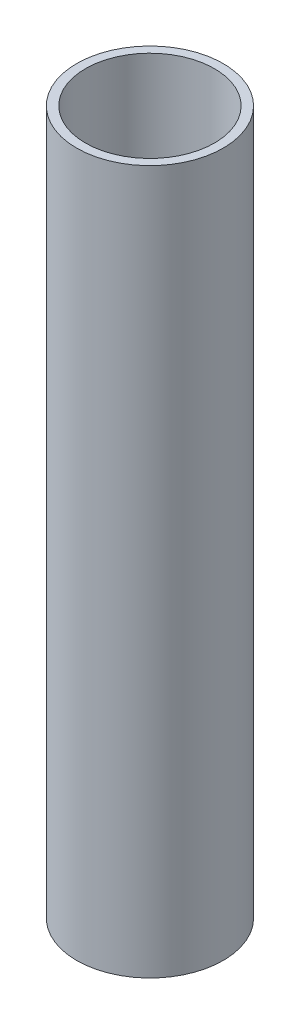
ISO-10303-21;
HEADER;
FILE_DESCRIPTION(('STEP AP214'),'2;1');
FILE_NAME('part.step','',(''),(''),'','','');
FILE_SCHEMA(('AUTOMOTIVE_DESIGN { 1 0 10303 214 1 1 1 1 }'));
ENDSEC;
DATA;
#1=APPLICATION_CONTEXT('core data for automotive mechanical design processes');
#2=APPLICATION_PROTOCOL_DEFINITION('international standard','automotive_design',2000,#1);
#3=PRODUCT_CONTEXT('',#1,'mechanical');
#4=PRODUCT('Part','Part','',(#3));
#5=PRODUCT_RELATED_PRODUCT_CATEGORY('part','',(#4));
#6=PRODUCT_DEFINITION_FORMATION('','',#4);
#7=PRODUCT_DEFINITION_CONTEXT('part definition',#1,'design');
#8=PRODUCT_DEFINITION('design','',#6,#7);
#9=PRODUCT_DEFINITION_SHAPE('','',#8);
#10=(LENGTH_UNIT() NAMED_UNIT(*) SI_UNIT(.MILLI.,.METRE.));
#11=(NAMED_UNIT(*) PLANE_ANGLE_UNIT() SI_UNIT($,.RADIAN.));
#12=(NAMED_UNIT(*) SI_UNIT($,.STERADIAN.) SOLID_ANGLE_UNIT());
#13=UNCERTAINTY_MEASURE_WITH_UNIT(LENGTH_MEASURE(1.E-05),#10,'distance_accuracy_value','');
#14=(GEOMETRIC_REPRESENTATION_CONTEXT(3) GLOBAL_UNCERTAINTY_ASSIGNED_CONTEXT((#13)) GLOBAL_UNIT_ASSIGNED_CONTEXT((#10,
#11,#12)) REPRESENTATION_CONTEXT('',''));
#15=CARTESIAN_POINT('',(0.,0.,0.));
#16=DIRECTION('',(0.,0.,1.));
#17=DIRECTION('',(1.,0.,0.));
#18=AXIS2_PLACEMENT_3D('',#15,#16,#17);
#19=CARTESIAN_POINT('',(0.,120.,0.));
#20=DIRECTION('',(0.,1.,0.));
#21=DIRECTION('',(0.,0.,1.));
#22=AXIS2_PLACEMENT_3D('',#19,#20,#21);
#23=PLANE('',#22);
#24=CARTESIAN_POINT('',(0.,120.,0.));
#25=DIRECTION('',(0.,1.,0.));
#26=DIRECTION('',(0.,0.,1.));
#27=AXIS2_PLACEMENT_3D('',#24,#25,#26);
#28=CIRCLE('',#27,12.5);
#29=CARTESIAN_POINT('',(0.,120.,12.5));
#30=VERTEX_POINT('',#29);
#31=EDGE_CURVE('E10',#30,#30,#28,.T.);
#32=ORIENTED_EDGE('',*,*,#31,.T.);
#33=EDGE_LOOP('',(#32));
#34=FACE_BOUND('',#33,.T.);
#35=CARTESIAN_POINT('',(0.,120.,0.));
#36=DIRECTION('',(0.,1.,0.));
#37=DIRECTION('',(0.,0.,1.));
#38=AXIS2_PLACEMENT_3D('',#35,#36,#37);
#39=CIRCLE('',#38,11.);
#40=CARTESIAN_POINT('',(0.,120.,11.));
#41=VERTEX_POINT('',#40);
#42=EDGE_CURVE('E50',#41,#41,#39,.T.);
#43=ORIENTED_EDGE('',*,*,#42,.F.);
#44=EDGE_LOOP('',(#43));
#45=FACE_BOUND('',#44,.T.);
#46=ADVANCED_FACE('F37',(#34,#45),#23,.T.);
#47=CARTESIAN_POINT('',(0.,0.,0.));
#48=DIRECTION('',(0.,1.,0.));
#49=DIRECTION('',(0.,0.,1.));
#50=AXIS2_PLACEMENT_3D('',#47,#48,#49);
#51=PLANE('',#50);
#52=CARTESIAN_POINT('',(0.,0.,0.));
#53=DIRECTION('',(0.,1.,0.));
#54=DIRECTION('',(0.,0.,1.));
#55=AXIS2_PLACEMENT_3D('',#52,#53,#54);
#56=CIRCLE('',#55,12.5);
#57=CARTESIAN_POINT('',(0.,0.,12.5));
#58=VERTEX_POINT('',#57);
#59=EDGE_CURVE('E41',#58,#58,#56,.T.);
#60=ORIENTED_EDGE('',*,*,#59,.F.);
#61=EDGE_LOOP('',(#60));
#62=FACE_BOUND('',#61,.T.);
#63=CARTESIAN_POINT('',(0.,0.,0.));
#64=DIRECTION('',(0.,1.,0.));
#65=DIRECTION('',(0.,0.,1.));
#66=AXIS2_PLACEMENT_3D('',#63,#64,#65);
#67=CIRCLE('',#66,11.);
#68=CARTESIAN_POINT('',(0.,0.,11.));
#69=VERTEX_POINT('',#68);
#70=EDGE_CURVE('E52',#69,#69,#67,.T.);
#71=ORIENTED_EDGE('',*,*,#70,.T.);
#72=EDGE_LOOP('',(#71));
#73=FACE_BOUND('',#72,.T.);
#74=ADVANCED_FACE('F64',(#62,#73),#51,.F.);
#75=CARTESIAN_POINT('',(0.,120.,0.));
#76=DIRECTION('',(0.,-1.,0.));
#77=DIRECTION('',(0.,0.,-1.));
#78=AXIS2_PLACEMENT_3D('',#75,#76,#77);
#79=CYLINDRICAL_SURFACE('',#78,12.5);
#80=ORIENTED_EDGE('',*,*,#31,.F.);
#81=EDGE_LOOP('',(#80));
#82=FACE_BOUND('',#81,.T.);
#83=ORIENTED_EDGE('',*,*,#59,.T.);
#84=EDGE_LOOP('',(#83));
#85=FACE_BOUND('',#84,.T.);
#86=ADVANCED_FACE('F39',(#82,#85),#79,.T.);
#87=CARTESIAN_POINT('',(0.,120.,0.));
#88=DIRECTION('',(0.,-1.,0.));
#89=DIRECTION('',(0.,0.,-1.));
#90=AXIS2_PLACEMENT_3D('',#87,#88,#89);
#91=CYLINDRICAL_SURFACE('',#90,11.);
#92=ORIENTED_EDGE('',*,*,#42,.T.);
#93=EDGE_LOOP('',(#92));
#94=FACE_BOUND('',#93,.T.);
#95=ORIENTED_EDGE('',*,*,#70,.F.);
#96=EDGE_LOOP('',(#95));
#97=FACE_BOUND('',#96,.T.);
#98=ADVANCED_FACE('F60',(#94,#97),#91,.F.);
#99=CLOSED_SHELL('',(#46,#74,#86,#98));
#100=MANIFOLD_SOLID_BREP('B2',#99);
#101=ADVANCED_BREP_SHAPE_REPRESENTATION('',(#18,#100),#14);
#102=SHAPE_DEFINITION_REPRESENTATION(#9,#101);
ENDSEC;
END-ISO-10303-21;
